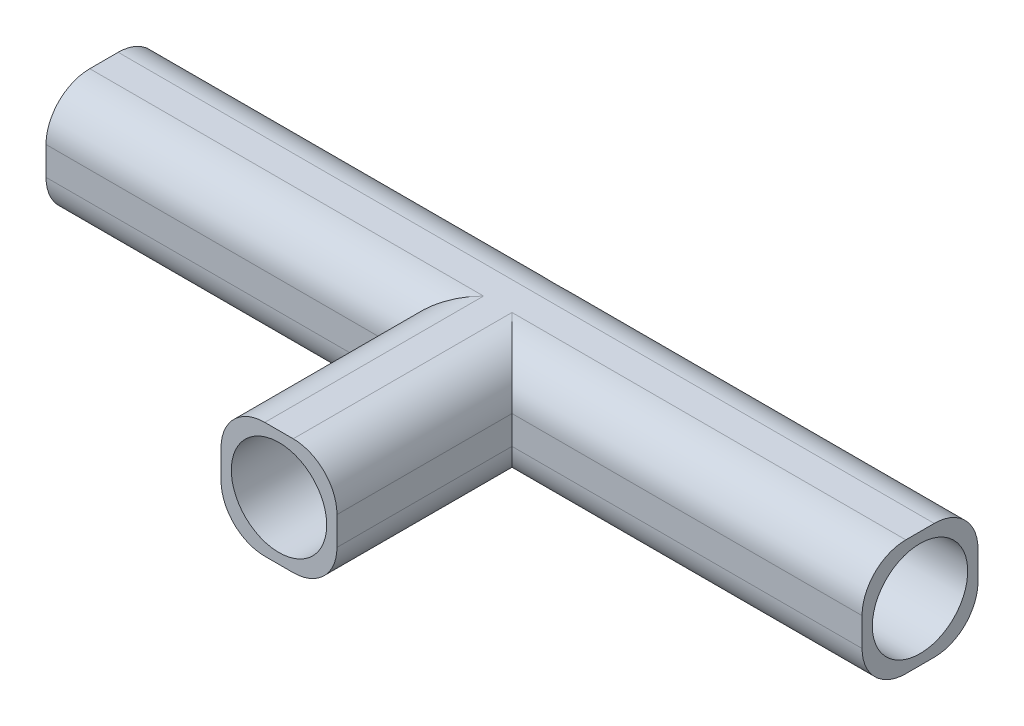
ISO-10303-21;
HEADER;
FILE_DESCRIPTION(('STEP AP214'),'2;1');
FILE_NAME('part.step','',(''),(''),'','','');
FILE_SCHEMA(('AUTOMOTIVE_DESIGN { 1 0 10303 214 1 1 1 1 }'));
ENDSEC;
DATA;
#1=APPLICATION_CONTEXT('core data for automotive mechanical design processes');
#2=APPLICATION_PROTOCOL_DEFINITION('international standard','automotive_design',2000,#1);
#3=PRODUCT_CONTEXT('',#1,'mechanical');
#4=PRODUCT('Part','Part','',(#3));
#5=PRODUCT_RELATED_PRODUCT_CATEGORY('part','',(#4));
#6=PRODUCT_DEFINITION_FORMATION('','',#4);
#7=PRODUCT_DEFINITION_CONTEXT('part definition',#1,'design');
#8=PRODUCT_DEFINITION('design','',#6,#7);
#9=PRODUCT_DEFINITION_SHAPE('','',#8);
#10=(LENGTH_UNIT() NAMED_UNIT(*) SI_UNIT(.MILLI.,.METRE.));
#11=(NAMED_UNIT(*) PLANE_ANGLE_UNIT() SI_UNIT($,.RADIAN.));
#12=(NAMED_UNIT(*) SI_UNIT($,.STERADIAN.) SOLID_ANGLE_UNIT());
#13=UNCERTAINTY_MEASURE_WITH_UNIT(LENGTH_MEASURE(1.E-05),#10,'distance_accuracy_value','');
#14=(GEOMETRIC_REPRESENTATION_CONTEXT(3) GLOBAL_UNCERTAINTY_ASSIGNED_CONTEXT((#13)) GLOBAL_UNIT_ASSIGNED_CONTEXT((#10,
#11,#12)) REPRESENTATION_CONTEXT('',''));
#15=CARTESIAN_POINT('',(0.,0.,0.));
#16=DIRECTION('',(0.,0.,1.));
#17=DIRECTION('',(1.,0.,0.));
#18=AXIS2_PLACEMENT_3D('',#15,#16,#17);
#19=CARTESIAN_POINT('',(0.,26.5,-66.5));
#20=DIRECTION('',(0.,0.,1.));
#21=DIRECTION('',(1.,0.,0.));
#22=AXIS2_PLACEMENT_3D('',#19,#20,#21);
#23=PLANE('',#22);
#24=DIRECTION('',(0.,-1.,0.));
#25=VECTOR('',#24,1.);
#26=CARTESIAN_POINT('',(-80.,26.5,-66.5));
#27=LINE('',#26,#25);
#28=CARTESIAN_POINT('',(-80.,16.5,-66.5));
#29=VERTEX_POINT('',#28);
#30=CARTESIAN_POINT('',(-80.,10.,-66.5));
#31=VERTEX_POINT('',#30);
#32=EDGE_CURVE('E191',#29,#31,#27,.T.);
#33=ORIENTED_EDGE('',*,*,#32,.F.);
#34=DIRECTION('',(-1.,0.,0.));
#35=VECTOR('',#34,1.);
#36=CARTESIAN_POINT('',(0.,16.5,-66.5));
#37=LINE('',#36,#35);
#38=CARTESIAN_POINT('',(2.8457941196841,16.5,-66.5));
#39=VERTEX_POINT('',#38);
#40=EDGE_CURVE('E312',#29,#39,#37,.F.);
#41=ORIENTED_EDGE('',*,*,#40,.T.);
#42=CARTESIAN_POINT('',(13.25,13.25,-66.5));
#43=DIRECTION('',(0.,0.,1.));
#44=DIRECTION('',(1.,0.,0.));
#45=AXIS2_PLACEMENT_3D('',#42,#43,#44);
#46=CIRCLE('',#45,10.9);
#47=CARTESIAN_POINT('',(2.8457941196841,10.,-66.5));
#48=VERTEX_POINT('',#47);
#49=EDGE_CURVE('E215',#39,#48,#46,.T.);
#50=ORIENTED_EDGE('',*,*,#49,.T.);
#51=DIRECTION('',(-1.,0.,0.));
#52=VECTOR('',#51,1.);
#53=CARTESIAN_POINT('',(-80.,10.,-66.5));
#54=LINE('',#53,#52);
#55=EDGE_CURVE('E310',#48,#31,#54,.T.);
#56=ORIENTED_EDGE('',*,*,#55,.T.);
#57=EDGE_LOOP('',(#33,#41,#50,#56));
#58=FACE_BOUND('',#57,.T.);
#59=ADVANCED_FACE('F39',(#58),#23,.F.);
#60=CARTESIAN_POINT('',(13.25,13.25,-66.5));
#61=DIRECTION('',(0.,0.,1.));
#62=DIRECTION('',(1.,0.,0.));
#63=AXIS2_PLACEMENT_3D('',#60,#61,#62);
#64=CYLINDRICAL_SURFACE('',#63,10.9);
#65=CARTESIAN_POINT('',(13.25,13.25,0.));
#66=DIRECTION('',(0.,0.,1.));
#67=DIRECTION('',(1.,0.,0.));
#68=AXIS2_PLACEMENT_3D('',#65,#66,#67);
#69=CIRCLE('',#68,10.9);
#70=CARTESIAN_POINT('',(24.15,13.25,0.));
#71=VERTEX_POINT('',#70);
#72=EDGE_CURVE('E207',#71,#71,#69,.T.);
#73=ORIENTED_EDGE('',*,*,#72,.T.);
#74=EDGE_LOOP('',(#73));
#75=FACE_BOUND('',#74,.T.);
#76=CARTESIAN_POINT('',(13.25,13.25,-53.25));
#77=DIRECTION('',(0.707106781186547,0.,0.707106781186547));
#78=DIRECTION('',(-0.707106781186547,0.,0.707106781186547));
#79=AXIS2_PLACEMENT_3D('',#76,#77,#78);
#80=ELLIPSE('',#79,15.4149278298667,10.9);
#81=CARTESIAN_POINT('',(13.25,2.35,-53.25));
#82=VERTEX_POINT('',#81);
#83=CARTESIAN_POINT('',(13.25,24.15,-53.25));
#84=VERTEX_POINT('',#83);
#85=EDGE_CURVE('E179',#82,#84,#80,.F.);
#86=ORIENTED_EDGE('',*,*,#85,.T.);
#87=CARTESIAN_POINT('',(13.25,13.25,-53.25));
#88=DIRECTION('',(-0.707106781186547,0.,0.707106781186547));
#89=DIRECTION('',(0.707106781186547,0.,0.707106781186547));
#90=AXIS2_PLACEMENT_3D('',#87,#88,#89);
#91=ELLIPSE('',#90,15.4149278298667,10.9);
#92=EDGE_CURVE('E176',#84,#82,#91,.F.);
#93=ORIENTED_EDGE('',*,*,#92,.T.);
#94=EDGE_LOOP('',(#86,#93));
#95=FACE_BOUND('',#94,.T.);
#96=ADVANCED_FACE('F189',(#75,#95),#64,.F.);
#97=CARTESIAN_POINT('',(0.,26.5,0.));
#98=DIRECTION('',(1.,0.,0.));
#99=DIRECTION('',(0.,0.,-1.));
#100=AXIS2_PLACEMENT_3D('',#97,#98,#99);
#101=PLANE('',#100);
#102=DIRECTION('',(0.,-1.,0.));
#103=VECTOR('',#102,1.);
#104=CARTESIAN_POINT('',(0.,26.5,0.));
#105=LINE('',#104,#103);
#106=CARTESIAN_POINT('',(0.,16.5,0.));
#107=VERTEX_POINT('',#106);
#108=CARTESIAN_POINT('',(0.,10.,0.));
#109=VERTEX_POINT('',#108);
#110=EDGE_CURVE('E225',#107,#109,#105,.T.);
#111=ORIENTED_EDGE('',*,*,#110,.F.);
#112=DIRECTION('',(0.,0.,1.));
#113=VECTOR('',#112,1.);
#114=CARTESIAN_POINT('',(0.,16.5,0.));
#115=LINE('',#114,#113);
#116=CARTESIAN_POINT('',(0.,16.5,-40.));
#117=VERTEX_POINT('',#116);
#118=EDGE_CURVE('E267',#107,#117,#115,.F.);
#119=ORIENTED_EDGE('',*,*,#118,.T.);
#120=DIRECTION('',(0.,1.,0.));
#121=VECTOR('',#120,1.);
#122=CARTESIAN_POINT('',(0.,26.5,-40.));
#123=LINE('',#122,#121);
#124=CARTESIAN_POINT('',(0.,10.,-40.));
#125=VERTEX_POINT('',#124);
#126=EDGE_CURVE('E186',#125,#117,#123,.T.);
#127=ORIENTED_EDGE('',*,*,#126,.F.);
#128=DIRECTION('',(0.,0.,1.));
#129=VECTOR('',#128,1.);
#130=CARTESIAN_POINT('',(0.,10.,0.));
#131=LINE('',#130,#129);
#132=EDGE_CURVE('E265',#125,#109,#131,.T.);
#133=ORIENTED_EDGE('',*,*,#132,.T.);
#134=EDGE_LOOP('',(#111,#119,#127,#133));
#135=FACE_BOUND('',#134,.T.);
#136=ADVANCED_FACE('F342',(#135),#101,.F.);
#137=CARTESIAN_POINT('',(26.5,26.5,0.));
#138=DIRECTION('',(0.,0.,-1.));
#139=DIRECTION('',(-1.,0.,0.));
#140=AXIS2_PLACEMENT_3D('',#137,#138,#139);
#141=PLANE('',#140);
#142=ORIENTED_EDGE('',*,*,#72,.F.);
#143=EDGE_LOOP('',(#142));
#144=FACE_BOUND('',#143,.T.);
#145=DIRECTION('',(1.,0.,0.));
#146=VECTOR('',#145,1.);
#147=CARTESIAN_POINT('',(26.5,26.5,0.));
#148=LINE('',#147,#146);
#149=CARTESIAN_POINT('',(10.,26.5,0.));
#150=VERTEX_POINT('',#149);
#151=CARTESIAN_POINT('',(16.5,26.5,0.));
#152=VERTEX_POINT('',#151);
#153=EDGE_CURVE('E213',#150,#152,#148,.T.);
#154=ORIENTED_EDGE('',*,*,#153,.F.);
#155=CARTESIAN_POINT('',(10.,16.5,0.));
#156=DIRECTION('',(0.,0.,-1.));
#157=DIRECTION('',(-1.,0.,0.));
#158=AXIS2_PLACEMENT_3D('',#155,#156,#157);
#159=CIRCLE('',#158,10.);
#160=EDGE_CURVE('E262',#150,#107,#159,.F.);
#161=ORIENTED_EDGE('',*,*,#160,.T.);
#162=ORIENTED_EDGE('',*,*,#110,.T.);
#163=CARTESIAN_POINT('',(10.,10.,0.));
#164=DIRECTION('',(0.,0.,-1.));
#165=DIRECTION('',(-1.,0.,0.));
#166=AXIS2_PLACEMENT_3D('',#163,#164,#165);
#167=CIRCLE('',#166,10.);
#168=CARTESIAN_POINT('',(10.,0.,0.));
#169=VERTEX_POINT('',#168);
#170=EDGE_CURVE('E260',#109,#169,#167,.F.);
#171=ORIENTED_EDGE('',*,*,#170,.T.);
#172=DIRECTION('',(1.,0.,0.));
#173=VECTOR('',#172,1.);
#174=CARTESIAN_POINT('',(26.5,0.,0.));
#175=LINE('',#174,#173);
#176=CARTESIAN_POINT('',(16.5,0.,0.));
#177=VERTEX_POINT('',#176);
#178=EDGE_CURVE('E223',#169,#177,#175,.T.);
#179=ORIENTED_EDGE('',*,*,#178,.T.);
#180=CARTESIAN_POINT('',(16.5,10.,0.));
#181=DIRECTION('',(0.,0.,-1.));
#182=DIRECTION('',(-1.,0.,0.));
#183=AXIS2_PLACEMENT_3D('',#180,#181,#182);
#184=CIRCLE('',#183,10.);
#185=CARTESIAN_POINT('',(26.5,10.,0.));
#186=VERTEX_POINT('',#185);
#187=EDGE_CURVE('E253',#177,#186,#184,.F.);
#188=ORIENTED_EDGE('',*,*,#187,.T.);
#189=DIRECTION('',(0.,-1.,0.));
#190=VECTOR('',#189,1.);
#191=CARTESIAN_POINT('',(26.5,26.5,0.));
#192=LINE('',#191,#190);
#193=CARTESIAN_POINT('',(26.5,16.5,0.));
#194=VERTEX_POINT('',#193);
#195=EDGE_CURVE('E237',#194,#186,#192,.T.);
#196=ORIENTED_EDGE('',*,*,#195,.F.);
#197=CARTESIAN_POINT('',(16.5,16.5,0.));
#198=DIRECTION('',(0.,0.,-1.));
#199=DIRECTION('',(-1.,0.,0.));
#200=AXIS2_PLACEMENT_3D('',#197,#198,#199);
#201=CIRCLE('',#200,10.);
#202=EDGE_CURVE('E256',#194,#152,#201,.F.);
#203=ORIENTED_EDGE('',*,*,#202,.T.);
#204=EDGE_LOOP('',(#154,#161,#162,#171,#179,#188,#196,#203));
#205=FACE_BOUND('',#204,.T.);
#206=ADVANCED_FACE('F341',(#144,#205),#141,.F.);
#207=CARTESIAN_POINT('',(26.5,26.5,-40.));
#208=DIRECTION('',(-1.,0.,0.));
#209=DIRECTION('',(0.,0.,1.));
#210=AXIS2_PLACEMENT_3D('',#207,#208,#209);
#211=PLANE('',#210);
#212=DIRECTION('',(0.,-1.,0.));
#213=VECTOR('',#212,1.);
#214=CARTESIAN_POINT('',(26.5,26.5,-40.));
#215=LINE('',#214,#213);
#216=CARTESIAN_POINT('',(26.5,16.5,-40.));
#217=VERTEX_POINT('',#216);
#218=CARTESIAN_POINT('',(26.5,10.,-40.));
#219=VERTEX_POINT('',#218);
#220=EDGE_CURVE('E236',#217,#219,#215,.T.);
#221=ORIENTED_EDGE('',*,*,#220,.F.);
#222=DIRECTION('',(0.,0.,-1.));
#223=VECTOR('',#222,1.);
#224=CARTESIAN_POINT('',(26.5,16.5,-40.));
#225=LINE('',#224,#223);
#226=EDGE_CURVE('E272',#217,#194,#225,.F.);
#227=ORIENTED_EDGE('',*,*,#226,.T.);
#228=ORIENTED_EDGE('',*,*,#195,.T.);
#229=DIRECTION('',(0.,0.,-1.));
#230=VECTOR('',#229,1.);
#231=CARTESIAN_POINT('',(26.5,10.,-40.));
#232=LINE('',#231,#230);
#233=EDGE_CURVE('E268',#186,#219,#232,.T.);
#234=ORIENTED_EDGE('',*,*,#233,.T.);
#235=EDGE_LOOP('',(#221,#227,#228,#234));
#236=FACE_BOUND('',#235,.T.);
#237=ADVANCED_FACE('F358',(#236),#211,.F.);
#238=CARTESIAN_POINT('',(106.5,26.5,-40.));
#239=DIRECTION('',(0.,0.,-1.));
#240=DIRECTION('',(-1.,0.,0.));
#241=AXIS2_PLACEMENT_3D('',#238,#239,#240);
#242=PLANE('',#241);
#243=ORIENTED_EDGE('',*,*,#220,.T.);
#244=DIRECTION('',(1.,0.,0.));
#245=VECTOR('',#244,1.);
#246=CARTESIAN_POINT('',(106.5,10.,-40.));
#247=LINE('',#246,#245);
#248=CARTESIAN_POINT('',(106.5,10.,-40.));
#249=VERTEX_POINT('',#248);
#250=EDGE_CURVE('E283',#219,#249,#247,.T.);
#251=ORIENTED_EDGE('',*,*,#250,.T.);
#252=DIRECTION('',(0.,-1.,0.));
#253=VECTOR('',#252,1.);
#254=CARTESIAN_POINT('',(106.5,26.5,-40.));
#255=LINE('',#254,#253);
#256=CARTESIAN_POINT('',(106.5,16.5,-40.));
#257=VERTEX_POINT('',#256);
#258=EDGE_CURVE('E231',#257,#249,#255,.T.);
#259=ORIENTED_EDGE('',*,*,#258,.F.);
#260=DIRECTION('',(1.,0.,0.));
#261=VECTOR('',#260,1.);
#262=CARTESIAN_POINT('',(106.5,16.5,-40.));
#263=LINE('',#262,#261);
#264=EDGE_CURVE('E285',#257,#217,#263,.F.);
#265=ORIENTED_EDGE('',*,*,#264,.T.);
#266=EDGE_LOOP('',(#243,#251,#259,#265));
#267=FACE_BOUND('',#266,.T.);
#268=ADVANCED_FACE('F355',(#267),#242,.F.);
#269=CARTESIAN_POINT('',(106.5,26.5,-66.5));
#270=DIRECTION('',(-1.,0.,0.));
#271=DIRECTION('',(0.,0.,1.));
#272=AXIS2_PLACEMENT_3D('',#269,#270,#271);
#273=PLANE('',#272);
#274=CARTESIAN_POINT('',(106.5,13.25,-53.25));
#275=DIRECTION('',(-1.,0.,0.));
#276=DIRECTION('',(0.,0.,1.));
#277=AXIS2_PLACEMENT_3D('',#274,#275,#276);
#278=CIRCLE('',#277,10.9);
#279=CARTESIAN_POINT('',(106.5,13.25,-42.35));
#280=VERTEX_POINT('',#279);
#281=EDGE_CURVE('E187',#280,#280,#278,.T.);
#282=ORIENTED_EDGE('',*,*,#281,.T.);
#283=EDGE_LOOP('',(#282));
#284=FACE_BOUND('',#283,.T.);
#285=ORIENTED_EDGE('',*,*,#258,.T.);
#286=CARTESIAN_POINT('',(106.5,10.,-50.));
#287=DIRECTION('',(-1.,0.,0.));
#288=DIRECTION('',(0.,0.,1.));
#289=AXIS2_PLACEMENT_3D('',#286,#287,#288);
#290=CIRCLE('',#289,10.);
#291=CARTESIAN_POINT('',(106.5,0.,-50.));
#292=VERTEX_POINT('',#291);
#293=EDGE_CURVE('E291',#249,#292,#290,.F.);
#294=ORIENTED_EDGE('',*,*,#293,.T.);
#295=DIRECTION('',(0.,0.,-1.));
#296=VECTOR('',#295,1.);
#297=CARTESIAN_POINT('',(106.5,0.,-66.5));
#298=LINE('',#297,#296);
#299=CARTESIAN_POINT('',(106.5,0.,-56.5));
#300=VERTEX_POINT('',#299);
#301=EDGE_CURVE('E216',#292,#300,#298,.T.);
#302=ORIENTED_EDGE('',*,*,#301,.T.);
#303=CARTESIAN_POINT('',(106.5,10.,-56.5));
#304=DIRECTION('',(-1.,0.,0.));
#305=DIRECTION('',(0.,0.,1.));
#306=AXIS2_PLACEMENT_3D('',#303,#304,#305);
#307=CIRCLE('',#306,10.);
#308=CARTESIAN_POINT('',(106.5,10.,-66.5));
#309=VERTEX_POINT('',#308);
#310=EDGE_CURVE('E290',#300,#309,#307,.F.);
#311=ORIENTED_EDGE('',*,*,#310,.T.);
#312=DIRECTION('',(0.,-1.,0.));
#313=VECTOR('',#312,1.);
#314=CARTESIAN_POINT('',(106.5,26.5,-66.5));
#315=LINE('',#314,#313);
#316=CARTESIAN_POINT('',(106.5,16.5,-66.5));
#317=VERTEX_POINT('',#316);
#318=EDGE_CURVE('E229',#317,#309,#315,.T.);
#319=ORIENTED_EDGE('',*,*,#318,.F.);
#320=CARTESIAN_POINT('',(106.5,16.5,-56.5));
#321=DIRECTION('',(-1.,0.,0.));
#322=DIRECTION('',(0.,0.,1.));
#323=AXIS2_PLACEMENT_3D('',#320,#321,#322);
#324=CIRCLE('',#323,10.);
#325=CARTESIAN_POINT('',(106.5,26.5,-56.5));
#326=VERTEX_POINT('',#325);
#327=EDGE_CURVE('E289',#317,#326,#324,.F.);
#328=ORIENTED_EDGE('',*,*,#327,.T.);
#329=DIRECTION('',(0.,0.,-1.));
#330=VECTOR('',#329,1.);
#331=CARTESIAN_POINT('',(106.5,26.5,-66.5));
#332=LINE('',#331,#330);
#333=CARTESIAN_POINT('',(106.5,26.5,-50.));
#334=VERTEX_POINT('',#333);
#335=EDGE_CURVE('E220',#334,#326,#332,.T.);
#336=ORIENTED_EDGE('',*,*,#335,.F.);
#337=CARTESIAN_POINT('',(106.5,16.5,-50.));
#338=DIRECTION('',(-1.,0.,0.));
#339=DIRECTION('',(0.,0.,1.));
#340=AXIS2_PLACEMENT_3D('',#337,#338,#339);
#341=CIRCLE('',#340,10.);
#342=EDGE_CURVE('E293',#334,#257,#341,.F.);
#343=ORIENTED_EDGE('',*,*,#342,.T.);
#344=EDGE_LOOP('',(#285,#294,#302,#311,#319,#328,#336,#343));
#345=FACE_BOUND('',#344,.T.);
#346=ADVANCED_FACE('F350',(#284,#345),#273,.F.);
#347=CARTESIAN_POINT('',(23.6542058803159,10.,-66.5));
#348=VERTEX_POINT('',#347);
#349=CARTESIAN_POINT('',(23.6542058803159,16.5,-66.5));
#350=VERTEX_POINT('',#349);
#351=EDGE_CURVE('E209',#348,#350,#46,.T.);
#352=ORIENTED_EDGE('',*,*,#351,.T.);
#353=DIRECTION('',(-1.,0.,0.));
#354=VECTOR('',#353,1.);
#355=CARTESIAN_POINT('',(0.,16.5,-66.5));
#356=LINE('',#355,#354);
#357=EDGE_CURVE('E311',#350,#317,#356,.F.);
#358=ORIENTED_EDGE('',*,*,#357,.T.);
#359=ORIENTED_EDGE('',*,*,#318,.T.);
#360=DIRECTION('',(-1.,0.,0.));
#361=VECTOR('',#360,1.);
#362=CARTESIAN_POINT('',(-80.,10.,-66.5));
#363=LINE('',#362,#361);
#364=EDGE_CURVE('E307',#309,#348,#363,.T.);
#365=ORIENTED_EDGE('',*,*,#364,.T.);
#366=EDGE_LOOP('',(#352,#358,#359,#365));
#367=FACE_BOUND('',#366,.T.);
#368=ADVANCED_FACE('F337',(#367),#23,.F.);
#369=CARTESIAN_POINT('',(0.,26.5,0.));
#370=DIRECTION('',(0.,-1.,0.));
#371=DIRECTION('',(0.,0.,-1.));
#372=AXIS2_PLACEMENT_3D('',#369,#370,#371);
#373=PLANE('',#372);
#374=ORIENTED_EDGE('',*,*,#153,.T.);
#375=DIRECTION('',(0.,0.,-1.));
#376=VECTOR('',#375,1.);
#377=CARTESIAN_POINT('',(16.5,26.5,0.));
#378=LINE('',#377,#376);
#379=CARTESIAN_POINT('',(16.5,26.5,-50.));
#380=VERTEX_POINT('',#379);
#381=EDGE_CURVE('E255',#152,#380,#378,.T.);
#382=ORIENTED_EDGE('',*,*,#381,.T.);
#383=DIRECTION('',(1.,0.,0.));
#384=VECTOR('',#383,1.);
#385=CARTESIAN_POINT('',(0.,26.5,-50.));
#386=LINE('',#385,#384);
#387=EDGE_CURVE('E249',#380,#334,#386,.T.);
#388=ORIENTED_EDGE('',*,*,#387,.T.);
#389=ORIENTED_EDGE('',*,*,#335,.T.);
#390=DIRECTION('',(-1.,0.,0.));
#391=VECTOR('',#390,1.);
#392=CARTESIAN_POINT('',(0.,26.5,-56.5));
#393=LINE('',#392,#391);
#394=CARTESIAN_POINT('',(-80.,26.5,-56.5));
#395=VERTEX_POINT('',#394);
#396=EDGE_CURVE('E245',#326,#395,#393,.T.);
#397=ORIENTED_EDGE('',*,*,#396,.T.);
#398=DIRECTION('',(0.,0.,-1.));
#399=VECTOR('',#398,1.);
#400=CARTESIAN_POINT('',(-80.,26.5,-66.5));
#401=LINE('',#400,#399);
#402=CARTESIAN_POINT('',(-80.,26.5,-50.));
#403=VERTEX_POINT('',#402);
#404=EDGE_CURVE('E203',#403,#395,#401,.T.);
#405=ORIENTED_EDGE('',*,*,#404,.F.);
#406=DIRECTION('',(1.,0.,0.));
#407=VECTOR('',#406,1.);
#408=CARTESIAN_POINT('',(0.,26.5,-50.));
#409=LINE('',#408,#407);
#410=CARTESIAN_POINT('',(10.,26.5,-50.));
#411=VERTEX_POINT('',#410);
#412=EDGE_CURVE('E244',#403,#411,#409,.T.);
#413=ORIENTED_EDGE('',*,*,#412,.T.);
#414=DIRECTION('',(0.,0.,1.));
#415=VECTOR('',#414,1.);
#416=CARTESIAN_POINT('',(10.,26.5,0.));
#417=LINE('',#416,#415);
#418=EDGE_CURVE('E250',#411,#150,#417,.T.);
#419=ORIENTED_EDGE('',*,*,#418,.T.);
#420=EDGE_LOOP('',(#374,#382,#388,#389,#397,#405,#413,#419));
#421=FACE_BOUND('',#420,.T.);
#422=ADVANCED_FACE('F335',(#421),#373,.F.);
#423=CARTESIAN_POINT('',(0.,0.,0.));
#424=DIRECTION('',(0.,-1.,0.));
#425=DIRECTION('',(0.,0.,-1.));
#426=AXIS2_PLACEMENT_3D('',#423,#424,#425);
#427=PLANE('',#426);
#428=DIRECTION('',(1.,0.,0.));
#429=VECTOR('',#428,1.);
#430=CARTESIAN_POINT('',(26.5,0.,-50.));
#431=LINE('',#430,#429);
#432=CARTESIAN_POINT('',(16.5,0.,-50.));
#433=VERTEX_POINT('',#432);
#434=EDGE_CURVE('E276',#292,#433,#431,.F.);
#435=ORIENTED_EDGE('',*,*,#434,.T.);
#436=DIRECTION('',(0.,0.,-1.));
#437=VECTOR('',#436,1.);
#438=CARTESIAN_POINT('',(16.5,0.,0.));
#439=LINE('',#438,#437);
#440=EDGE_CURVE('E282',#433,#177,#439,.F.);
#441=ORIENTED_EDGE('',*,*,#440,.T.);
#442=ORIENTED_EDGE('',*,*,#178,.F.);
#443=DIRECTION('',(0.,0.,1.));
#444=VECTOR('',#443,1.);
#445=CARTESIAN_POINT('',(10.,0.,-40.));
#446=LINE('',#445,#444);
#447=CARTESIAN_POINT('',(10.,0.,-50.));
#448=VERTEX_POINT('',#447);
#449=EDGE_CURVE('E273',#169,#448,#446,.F.);
#450=ORIENTED_EDGE('',*,*,#449,.T.);
#451=DIRECTION('',(1.,0.,0.));
#452=VECTOR('',#451,1.);
#453=CARTESIAN_POINT('',(-80.,0.,-50.));
#454=LINE('',#453,#452);
#455=CARTESIAN_POINT('',(-80.,0.,-50.));
#456=VERTEX_POINT('',#455);
#457=EDGE_CURVE('E271',#448,#456,#454,.F.);
#458=ORIENTED_EDGE('',*,*,#457,.T.);
#459=DIRECTION('',(0.,0.,1.));
#460=VECTOR('',#459,1.);
#461=CARTESIAN_POINT('',(-80.,0.,-66.5));
#462=LINE('',#461,#460);
#463=CARTESIAN_POINT('',(-80.,0.,-56.5));
#464=VERTEX_POINT('',#463);
#465=EDGE_CURVE('E199',#464,#456,#462,.T.);
#466=ORIENTED_EDGE('',*,*,#465,.F.);
#467=DIRECTION('',(-1.,0.,0.));
#468=VECTOR('',#467,1.);
#469=CARTESIAN_POINT('',(106.5,0.,-56.5));
#470=LINE('',#469,#468);
#471=EDGE_CURVE('E280',#464,#300,#470,.F.);
#472=ORIENTED_EDGE('',*,*,#471,.T.);
#473=ORIENTED_EDGE('',*,*,#301,.F.);
#474=EDGE_LOOP('',(#435,#441,#442,#450,#458,#466,#472,#473));
#475=FACE_BOUND('',#474,.T.);
#476=ADVANCED_FACE('F328',(#475),#427,.T.);
#477=CARTESIAN_POINT('',(13.25,13.25,-53.25));
#478=DIRECTION('',(0.707106781186547,0.,0.707106781186547));
#479=DIRECTION('',(-0.707106781186547,0.,0.707106781186547));
#480=AXIS2_PLACEMENT_3D('',#477,#478,#479);
#481=ELLIPSE('',#480,15.4149278298667,10.9);
#482=EDGE_CURVE('E175',#82,#84,#481,.T.);
#483=ORIENTED_EDGE('',*,*,#482,.T.);
#484=CARTESIAN_POINT('',(13.25,13.25,-53.25));
#485=DIRECTION('',(-0.707106781186547,0.,0.707106781186547));
#486=DIRECTION('',(0.707106781186547,0.,0.707106781186547));
#487=AXIS2_PLACEMENT_3D('',#484,#485,#486);
#488=ELLIPSE('',#487,15.4149278298667,10.9);
#489=EDGE_CURVE('E177',#84,#82,#488,.T.);
#490=ORIENTED_EDGE('',*,*,#489,.T.);
#491=EDGE_LOOP('',(#483,#490));
#492=FACE_BOUND('',#491,.T.);
#493=ORIENTED_EDGE('',*,*,#49,.F.);
#494=CARTESIAN_POINT('',(2.8457941196841,16.5,-66.5));
#495=CARTESIAN_POINT('',(2.88464672592702,16.6243861980135,-66.5000018375319));
#496=CARTESIAN_POINT('',(2.92572709811874,16.7480493403431,-66.4976787328515));
#497=CARTESIAN_POINT('',(3.01222916332854,16.993660215835,-66.4885632084519));
#498=CARTESIAN_POINT('',(3.05765017352658,17.1156082153532,-66.4817714906982));
#499=CARTESIAN_POINT('',(3.200118274816,17.4781421129981,-66.4549919974717));
#500=CARTESIAN_POINT('',(3.30349699397758,17.7158223848886,-66.4285986984506));
#501=CARTESIAN_POINT('',(3.52484795963407,18.1791758892328,-66.3607668546852));
#502=CARTESIAN_POINT('',(3.64267398274478,18.4049409452479,-66.3194719824814));
#503=CARTESIAN_POINT('',(3.89248232874132,18.8456266620614,-66.2236259048918));
#504=CARTESIAN_POINT('',(4.02446922456363,19.0605437866186,-66.1690704100441));
#505=CARTESIAN_POINT('',(4.30058286463675,19.4773659285029,-66.0489304604639));
#506=CARTESIAN_POINT('',(4.44463848843064,19.679336291958,-65.9834086221667));
#507=CARTESIAN_POINT('',(4.744355018924,20.070911034265,-65.8430132638185));
#508=CARTESIAN_POINT('',(4.90001501929407,20.2605163766906,-65.7681404737913));
#509=CARTESIAN_POINT('',(5.38388466942829,20.8113085016247,-65.531738563742));
#510=CARTESIAN_POINT('',(5.72838774348211,21.1535800974453,-65.3586970408249));
#511=CARTESIAN_POINT('',(6.30393931994564,21.6548787505474,-65.0716382764976));
#512=CARTESIAN_POINT('',(6.52300907320189,21.8311618655614,-64.9627957876634));
#513=CARTESIAN_POINT('',(6.97332608430999,22.1658293228224,-64.7424783730553));
#514=CARTESIAN_POINT('',(7.20457533714213,22.3242107193495,-64.6310030176823));
#515=CARTESIAN_POINT('',(7.67879167476865,22.6228442770978,-64.408569199843));
#516=CARTESIAN_POINT('',(7.921761472171,22.7630922135932,-64.2976108636152));
#517=CARTESIAN_POINT('',(8.41919724733462,23.0250875935412,-64.0797249670166));
#518=CARTESIAN_POINT('',(8.67366100904052,23.1468385836509,-63.9727966368852));
#519=CARTESIAN_POINT('',(9.14587471418709,23.3504685629058,-63.7860476625262));
#520=CARTESIAN_POINT('',(9.36170635649495,23.4355568242152,-63.7048720080955));
#521=CARTESIAN_POINT('',(9.80090306979361,23.5925385470033,-63.5503915904373));
#522=CARTESIAN_POINT('',(10.0242680493896,23.664432168492,-63.4770867317659));
#523=CARTESIAN_POINT('',(10.4777250282644,23.7941916712698,-63.3413139231623));
#524=CARTESIAN_POINT('',(10.7078012559922,23.8520878717172,-63.2788226355229));
#525=CARTESIAN_POINT('',(11.1744064602184,23.9532165017965,-63.1674765729432));
#526=CARTESIAN_POINT('',(11.4109338072887,23.9964525978999,-63.118618388925));
#527=CARTESIAN_POINT('',(11.8486622052475,24.0614102205505,-63.044240387643));
#528=CARTESIAN_POINT('',(12.0490732546009,24.0855335673666,-63.0161711089286));
#529=CARTESIAN_POINT('',(12.4522916342809,24.1226551571158,-62.9727085862606));
#530=CARTESIAN_POINT('',(12.6550986575942,24.1356548100637,-62.9573137357338));
#531=CARTESIAN_POINT('',(13.0615647563208,24.1502668784086,-62.9399959887514));
#532=CARTESIAN_POINT('',(13.2652231496363,24.1518871209526,-62.9380638322026));
#533=CARTESIAN_POINT('',(13.6719896367206,24.1437281486369,-62.9477482717478));
#534=CARTESIAN_POINT('',(13.8750977079185,24.1339484731085,-62.9593654153669));
#535=CARTESIAN_POINT('',(14.2785068502842,24.10324528777,-62.9954763959438));
#536=CARTESIAN_POINT('',(14.4788157390124,24.082365018374,-63.0199202638945));
#537=CARTESIAN_POINT('',(14.8762667727059,24.0298654055655,-63.0804801743603));
#538=CARTESIAN_POINT('',(15.0734075057524,23.9982414058973,-63.1166012773763));
#539=CARTESIAN_POINT('',(15.6591744890684,23.8878444858726,-63.2403272164784));
#540=CARTESIAN_POINT('',(16.0417717477987,23.7935763709773,-63.3432563684598));
#541=CARTESIAN_POINT('',(16.7084080999205,23.591387989085,-63.551850448044));
#542=CARTESIAN_POINT('',(16.9963103371359,23.4904588422306,-63.6524302156835));
#543=CARTESIAN_POINT('',(17.5593750794149,23.26653827981,-63.8646297563021));
#544=CARTESIAN_POINT('',(17.8345306170234,23.1435349732412,-63.9762554649452));
#545=CARTESIAN_POINT('',(18.3725077275348,22.8760297628935,-64.2056724221931));
#546=CARTESIAN_POINT('',(18.6352931414189,22.7314694280386,-64.3234798458809));
#547=CARTESIAN_POINT('',(19.1475628503551,22.4216043315495,-64.560562404601));
#548=CARTESIAN_POINT('',(19.397049286503,22.2563029236261,-64.6798372995459));
#549=CARTESIAN_POINT('',(19.8907535658075,21.899070358283,-64.9200934612386));
#550=CARTESIAN_POINT('',(20.1344893692392,21.7064149823394,-65.0409906659449));
#551=CARTESIAN_POINT('',(20.6064364452311,21.2992213865969,-65.2762620277438));
#552=CARTESIAN_POINT('',(20.8346461759613,21.0846809987601,-65.3906355368134));
#553=CARTESIAN_POINT('',(21.2729703473606,20.6351189096964,-65.6083947476499));
#554=CARTESIAN_POINT('',(21.4831727359769,20.4002095460314,-65.7118345078329));
#555=CARTESIAN_POINT('',(21.884912764795,19.9094860178896,-65.9045118249119));
#556=CARTESIAN_POINT('',(22.0764544423562,19.6536763974311,-65.9937524565339));
#557=CARTESIAN_POINT('',(22.4048926039035,19.1716930181385,-66.1391441281059));
#558=CARTESIAN_POINT('',(22.5453272809355,18.9488539676513,-66.198362467987));
#559=CARTESIAN_POINT('',(22.8108706859483,18.4911550937411,-66.3025687808535));
#560=CARTESIAN_POINT('',(22.9359872740858,18.256301523782,-66.3475640710087));
#561=CARTESIAN_POINT('',(23.1709155621477,17.7730934878217,-66.4216739654849));
#562=CARTESIAN_POINT('',(23.2805328872315,17.5246140122395,-66.4505982970072));
#563=CARTESIAN_POINT('',(23.4311714877529,17.1451696299842,-66.4799757738569));
#564=CARTESIAN_POINT('',(23.4791271841872,17.0174371803611,-66.4874338518369));
#565=CARTESIAN_POINT('',(23.5702743819592,16.7600689361994,-66.4974475398995));
#566=CARTESIAN_POINT('',(23.613465002702,16.6304327948541,-66.5000022452554));
#567=CARTESIAN_POINT('',(23.6542058803159,16.5,-66.5));
#568=B_SPLINE_CURVE_WITH_KNOTS('',3,(#494,#495,#496,#497,#498,#499,#500,#501,#502,#503,#504,
#505,#506,#507,#508,#509,#510,#511,#512,#513,#514,#515,#516,#517,#518,#519,#520,#521,#522,#523,
#524,#525,#526,#527,#528,#529,#530,#531,#532,#533,#534,#535,#536,#537,#538,#539,#540,#541,#542,
#543,#544,#545,#546,#547,#548,#549,#550,#551,#552,#553,#554,#555,#556,#557,#558,#559,#560,#561,
#562,#563,#564,#565,#566,#567),.UNSPECIFIED.,.F.,.F.,(4,2,2,2,2,2,2,2,2,2,2,2,2,2,2,2,2,2,2,2,2,
2,2,2,2,2,2,2,2,2,2,2,2,2,2,2,4),(0.,0.390848926054824,0.78163646907384,1.56194565907483,
2.33492420445955,3.10815312156135,3.87710887922689,4.6460046424128,6.1870839483925,
7.09103210749795,7.99512879498972,8.89943574044322,9.80356907207933,10.5404167209573,
11.2772554335757,12.0124835205342,12.7475275921188,13.3582720305828,13.9689390409563,
14.5791859725426,15.189457564964,15.7973691846621,16.4055446057174,17.6230143822188,
18.5855721736446,19.5486500447985,20.5143874882759,21.4799689783793,22.4790054678226,
23.4781410230633,24.4720795971041,25.4658026466376,26.2747388807275,27.0832582707595,
27.9011565944795,28.3109199620505,28.7207589282482),.UNSPECIFIED.);
#569=EDGE_CURVE('E11',#39,#350,#568,.T.);
#570=ORIENTED_EDGE('',*,*,#569,.T.);
#571=ORIENTED_EDGE('',*,*,#351,.F.);
#572=CARTESIAN_POINT('',(23.6542058803159,10.,-66.5));
#573=CARTESIAN_POINT('',(23.615353274073,9.87561380198645,-66.5000018375319));
#574=CARTESIAN_POINT('',(23.5742729018813,9.75195065965694,-66.4976787328515));
#575=CARTESIAN_POINT('',(23.4877708366715,9.50633978416503,-66.4885632084519));
#576=CARTESIAN_POINT('',(23.4423498264734,9.38439178464682,-66.4817714906982));
#577=CARTESIAN_POINT('',(23.299881725184,9.02185788700186,-66.4549919974717));
#578=CARTESIAN_POINT('',(23.1965030060224,8.78417761511139,-66.4285986984506));
#579=CARTESIAN_POINT('',(22.9751520403659,8.3208241107672,-66.3607668546852));
#580=CARTESIAN_POINT('',(22.8573260172552,8.0950590547521,-66.3194719824814));
#581=CARTESIAN_POINT('',(22.6075176712587,7.65437333793856,-66.2236259048918));
#582=CARTESIAN_POINT('',(22.4755307754364,7.43945621338143,-66.1690704100441));
#583=CARTESIAN_POINT('',(22.1994171353633,7.02263407149709,-66.0489304604639));
#584=CARTESIAN_POINT('',(22.0553615115694,6.82066370804202,-65.9834086221667));
#585=CARTESIAN_POINT('',(21.755644981076,6.42908896573497,-65.8430132638185));
#586=CARTESIAN_POINT('',(21.5999849807059,6.23948362330945,-65.7681404737913));
#587=CARTESIAN_POINT('',(21.1161153305717,5.68869149837528,-65.531738563742));
#588=CARTESIAN_POINT('',(20.7716122565179,5.34641990255469,-65.3586970408249));
#589=CARTESIAN_POINT('',(20.1960606800544,4.84512124945263,-65.0716382764976));
#590=CARTESIAN_POINT('',(19.9769909267981,4.66883813443863,-64.9627957876634));
#591=CARTESIAN_POINT('',(19.52667391569,4.33417067717764,-64.7424783730553));
#592=CARTESIAN_POINT('',(19.2954246628579,4.17578928065046,-64.6310030176823));
#593=CARTESIAN_POINT('',(18.8212083252313,3.87715572290216,-64.408569199843));
#594=CARTESIAN_POINT('',(18.578238527829,3.73690778640681,-64.2976108636152));
#595=CARTESIAN_POINT('',(18.0808027526654,3.47491240645877,-64.0797249670166));
#596=CARTESIAN_POINT('',(17.8263389909595,3.35316141634906,-63.9727966368852));
#597=CARTESIAN_POINT('',(17.3541252858129,3.14953143709417,-63.7860476625262));
#598=CARTESIAN_POINT('',(17.1382936435051,3.06444317578484,-63.7048720080955));
#599=CARTESIAN_POINT('',(16.6990969302064,2.90746145299671,-63.5503915904373));
#600=CARTESIAN_POINT('',(16.4757319506104,2.835567831508,-63.4770867317659));
#601=CARTESIAN_POINT('',(16.0222749717356,2.7058083287302,-63.3413139231623));
#602=CARTESIAN_POINT('',(15.7921987440078,2.64791212828283,-63.2788226355229));
#603=CARTESIAN_POINT('',(15.3255935397816,2.54678349820351,-63.1674765729432));
#604=CARTESIAN_POINT('',(15.0890661927113,2.50354740210011,-63.118618388925));
#605=CARTESIAN_POINT('',(14.6513377947525,2.43858977944946,-63.044240387643));
#606=CARTESIAN_POINT('',(14.4509267453991,2.41446643263336,-63.0161711089286));
#607=CARTESIAN_POINT('',(14.047708365719,2.37734484288424,-62.9727085862606));
#608=CARTESIAN_POINT('',(13.8449013424058,2.36434518993631,-62.9573137357338));
#609=CARTESIAN_POINT('',(13.4384352436792,2.34973312159136,-62.9399959887514));
#610=CARTESIAN_POINT('',(13.2347768503637,2.34811287904744,-62.9380638322026));
#611=CARTESIAN_POINT('',(12.8280103632794,2.35627185136307,-62.9477482717478));
#612=CARTESIAN_POINT('',(12.6249022920815,2.36605152689148,-62.9593654153669));
#613=CARTESIAN_POINT('',(12.2214931497158,2.39675471223002,-62.9954763959438));
#614=CARTESIAN_POINT('',(12.0211842609876,2.41763498162603,-63.0199202638945));
#615=CARTESIAN_POINT('',(11.6237332272941,2.47013459443447,-63.0804801743603));
#616=CARTESIAN_POINT('',(11.4265924942476,2.50175859410271,-63.1166012773763));
#617=CARTESIAN_POINT('',(10.8408255109316,2.61215551412741,-63.2403272164784));
#618=CARTESIAN_POINT('',(10.4582282522013,2.7064236290227,-63.3432563684598));
#619=CARTESIAN_POINT('',(9.79159190007948,2.90861201091502,-63.551850448044));
#620=CARTESIAN_POINT('',(9.50368966286409,3.00954115776937,-63.6524302156835));
#621=CARTESIAN_POINT('',(8.94062492058509,3.23346172018999,-63.8646297563021));
#622=CARTESIAN_POINT('',(8.6654693829766,3.35646502675883,-63.9762554649452));
#623=CARTESIAN_POINT('',(8.12749227246521,3.62397023710648,-64.2056724221931));
#624=CARTESIAN_POINT('',(7.86470685858113,3.76853057196142,-64.3234798458809));
#625=CARTESIAN_POINT('',(7.35243714964485,4.07839566845047,-64.560562404601));
#626=CARTESIAN_POINT('',(7.10295071349696,4.24369707637388,-64.6798372995459));
#627=CARTESIAN_POINT('',(6.60924643419247,4.60092964171698,-64.9200934612386));
#628=CARTESIAN_POINT('',(6.36551063076076,4.79358501766057,-65.0409906659449));
#629=CARTESIAN_POINT('',(5.8935635547689,5.20077861340313,-65.2762620277438));
#630=CARTESIAN_POINT('',(5.6653538240387,5.41531900123986,-65.3906355368134));
#631=CARTESIAN_POINT('',(5.22702965263943,5.86488109030358,-65.6083947476499));
#632=CARTESIAN_POINT('',(5.01682726402313,6.09979045396858,-65.7118345078329));
#633=CARTESIAN_POINT('',(4.61508723520496,6.59051398211042,-65.9045118249119));
#634=CARTESIAN_POINT('',(4.42354555764385,6.84632360256887,-65.9937524565339));
#635=CARTESIAN_POINT('',(4.09510739609646,7.32830698186155,-66.1391441281059));
#636=CARTESIAN_POINT('',(3.95467271906451,7.55114603234875,-66.198362467987));
#637=CARTESIAN_POINT('',(3.68912931405172,8.00884490625886,-66.3025687808535));
#638=CARTESIAN_POINT('',(3.56401272591424,8.24369847621799,-66.3475640710087));
#639=CARTESIAN_POINT('',(3.3290844378523,8.72690651217834,-66.4216739654849));
#640=CARTESIAN_POINT('',(3.21946711276854,8.97538598776048,-66.4505982970072));
#641=CARTESIAN_POINT('',(3.06882851224709,9.35483037001581,-66.4799757738569));
#642=CARTESIAN_POINT('',(3.02087281581275,9.48256281963891,-66.4874338518369));
#643=CARTESIAN_POINT('',(2.92972561804084,9.73993106380055,-66.4974475398995));
#644=CARTESIAN_POINT('',(2.88653499729801,9.86956720514589,-66.5000022452554));
#645=CARTESIAN_POINT('',(2.8457941196841,9.99999999999999,-66.5));
#646=B_SPLINE_CURVE_WITH_KNOTS('',3,(#572,#573,#574,#575,#576,#577,#578,#579,#580,#581,#582,
#583,#584,#585,#586,#587,#588,#589,#590,#591,#592,#593,#594,#595,#596,#597,#598,#599,#600,#601,
#602,#603,#604,#605,#606,#607,#608,#609,#610,#611,#612,#613,#614,#615,#616,#617,#618,#619,#620,
#621,#622,#623,#624,#625,#626,#627,#628,#629,#630,#631,#632,#633,#634,#635,#636,#637,#638,#639,
#640,#641,#642,#643,#644,#645),.UNSPECIFIED.,.F.,.F.,(4,2,2,2,2,2,2,2,2,2,2,2,2,2,2,2,2,2,2,2,2,
2,2,2,2,2,2,2,2,2,2,2,2,2,2,2,4),(0.,0.390848926054822,0.78163646907384,1.56194565907483,
2.33492420445955,3.10815312156134,3.87710887922687,4.64600464241279,6.18708394839249,
7.09103210749795,7.99512879498971,8.89943574044321,9.80356907207932,10.5404167209573,
11.2772554335757,12.0124835205342,12.7475275921188,13.3582720305828,13.9689390409563,
14.5791859725426,15.189457564964,15.7973691846621,16.4055446057174,17.6230143822188,
18.5855721736446,19.5486500447985,20.5143874882759,21.4799689783793,22.4790054678226,
23.4781410230633,24.4720795971041,25.4658026466376,26.2747388807274,27.0832582707595,
27.9011565944795,28.3109199620505,28.7207589282482),.UNSPECIFIED.);
#647=EDGE_CURVE('E47',#348,#48,#646,.T.);
#648=ORIENTED_EDGE('',*,*,#647,.T.);
#649=EDGE_LOOP('',(#493,#570,#571,#648));
#650=FACE_BOUND('',#649,.T.);
#651=ADVANCED_FACE('F192',(#492,#650),#64,.F.);
#652=CARTESIAN_POINT('',(-80.,26.5,-40.));
#653=DIRECTION('',(0.,0.,-1.));
#654=DIRECTION('',(-1.,0.,0.));
#655=AXIS2_PLACEMENT_3D('',#652,#653,#654);
#656=PLANE('',#655);
#657=ORIENTED_EDGE('',*,*,#126,.T.);
#658=DIRECTION('',(1.,0.,0.));
#659=VECTOR('',#658,1.);
#660=CARTESIAN_POINT('',(-80.,16.5,-40.));
#661=LINE('',#660,#659);
#662=CARTESIAN_POINT('',(-80.,16.5,-40.));
#663=VERTEX_POINT('',#662);
#664=EDGE_CURVE('E300',#117,#663,#661,.F.);
#665=ORIENTED_EDGE('',*,*,#664,.T.);
#666=DIRECTION('',(0.,1.,0.));
#667=VECTOR('',#666,1.);
#668=CARTESIAN_POINT('',(-80.,26.5,-40.));
#669=LINE('',#668,#667);
#670=CARTESIAN_POINT('',(-80.,10.,-40.));
#671=VERTEX_POINT('',#670);
#672=EDGE_CURVE('E198',#671,#663,#669,.T.);
#673=ORIENTED_EDGE('',*,*,#672,.F.);
#674=DIRECTION('',(1.,0.,0.));
#675=VECTOR('',#674,1.);
#676=CARTESIAN_POINT('',(0.,10.,-40.));
#677=LINE('',#676,#675);
#678=EDGE_CURVE('E294',#671,#125,#677,.T.);
#679=ORIENTED_EDGE('',*,*,#678,.T.);
#680=EDGE_LOOP('',(#657,#665,#673,#679));
#681=FACE_BOUND('',#680,.T.);
#682=ADVANCED_FACE('F326',(#681),#656,.F.);
#683=CARTESIAN_POINT('',(-80.,0.,0.));
#684=DIRECTION('',(-1.,0.,0.));
#685=DIRECTION('',(0.,0.,1.));
#686=AXIS2_PLACEMENT_3D('',#683,#684,#685);
#687=PLANE('',#686);
#688=CARTESIAN_POINT('',(-80.,13.25,-53.25));
#689=DIRECTION('',(-1.,0.,0.));
#690=DIRECTION('',(0.,0.,1.));
#691=AXIS2_PLACEMENT_3D('',#688,#689,#690);
#692=CIRCLE('',#691,10.9);
#693=CARTESIAN_POINT('',(-80.,13.25,-42.35));
#694=VERTEX_POINT('',#693);
#695=EDGE_CURVE('E438',#694,#694,#692,.T.);
#696=ORIENTED_EDGE('',*,*,#695,.F.);
#697=EDGE_LOOP('',(#696));
#698=FACE_BOUND('',#697,.T.);
#699=ORIENTED_EDGE('',*,*,#672,.T.);
#700=CARTESIAN_POINT('',(-80.,16.5,-50.));
#701=DIRECTION('',(-1.,0.,0.));
#702=DIRECTION('',(0.,0.,1.));
#703=AXIS2_PLACEMENT_3D('',#700,#701,#702);
#704=CIRCLE('',#703,10.);
#705=EDGE_CURVE('E304',#663,#403,#704,.T.);
#706=ORIENTED_EDGE('',*,*,#705,.T.);
#707=ORIENTED_EDGE('',*,*,#404,.T.);
#708=CARTESIAN_POINT('',(-80.,16.5,-56.5));
#709=DIRECTION('',(-1.,0.,0.));
#710=DIRECTION('',(0.,0.,1.));
#711=AXIS2_PLACEMENT_3D('',#708,#709,#710);
#712=CIRCLE('',#711,10.);
#713=EDGE_CURVE('E303',#395,#29,#712,.T.);
#714=ORIENTED_EDGE('',*,*,#713,.T.);
#715=ORIENTED_EDGE('',*,*,#32,.T.);
#716=CARTESIAN_POINT('',(-80.,10.,-56.5));
#717=DIRECTION('',(-1.,0.,0.));
#718=DIRECTION('',(0.,0.,1.));
#719=AXIS2_PLACEMENT_3D('',#716,#717,#718);
#720=CIRCLE('',#719,10.);
#721=EDGE_CURVE('E301',#31,#464,#720,.T.);
#722=ORIENTED_EDGE('',*,*,#721,.T.);
#723=ORIENTED_EDGE('',*,*,#465,.T.);
#724=CARTESIAN_POINT('',(-80.,10.,-50.));
#725=DIRECTION('',(-1.,0.,0.));
#726=DIRECTION('',(0.,0.,1.));
#727=AXIS2_PLACEMENT_3D('',#724,#725,#726);
#728=CIRCLE('',#727,10.);
#729=EDGE_CURVE('E299',#456,#671,#728,.T.);
#730=ORIENTED_EDGE('',*,*,#729,.T.);
#731=EDGE_LOOP('',(#699,#706,#707,#714,#715,#722,#723,#730));
#732=FACE_BOUND('',#731,.T.);
#733=ADVANCED_FACE('F451',(#698,#732),#687,.T.);
#734=CARTESIAN_POINT('',(106.5,13.25,-53.25));
#735=DIRECTION('',(-1.,0.,0.));
#736=DIRECTION('',(0.,0.,1.));
#737=AXIS2_PLACEMENT_3D('',#734,#735,#736);
#738=CYLINDRICAL_SURFACE('',#737,10.9);
#739=ORIENTED_EDGE('',*,*,#695,.T.);
#740=EDGE_LOOP('',(#739));
#741=FACE_BOUND('',#740,.T.);
#742=ORIENTED_EDGE('',*,*,#85,.F.);
#743=ORIENTED_EDGE('',*,*,#489,.F.);
#744=EDGE_LOOP('',(#742,#743));
#745=FACE_BOUND('',#744,.T.);
#746=ADVANCED_FACE('F183',(#741,#745),#738,.F.);
#747=ORIENTED_EDGE('',*,*,#281,.F.);
#748=EDGE_LOOP('',(#747));
#749=FACE_BOUND('',#748,.T.);
#750=ORIENTED_EDGE('',*,*,#482,.F.);
#751=ORIENTED_EDGE('',*,*,#92,.F.);
#752=EDGE_LOOP('',(#750,#751));
#753=FACE_BOUND('',#752,.T.);
#754=ADVANCED_FACE('F172',(#749,#753),#738,.F.);
#755=CARTESIAN_POINT('',(0.,16.5,-50.));
#756=DIRECTION('',(1.,0.,0.));
#757=DIRECTION('',(0.,0.,-1.));
#758=AXIS2_PLACEMENT_3D('',#755,#756,#757);
#759=CYLINDRICAL_SURFACE('',#758,10.);
#760=ORIENTED_EDGE('',*,*,#705,.F.);
#761=ORIENTED_EDGE('',*,*,#664,.F.);
#762=CARTESIAN_POINT('',(10.,16.5,-50.));
#763=DIRECTION('',(0.707106781186547,0.,0.707106781186547));
#764=DIRECTION('',(-0.707106781186547,0.,0.707106781186547));
#765=AXIS2_PLACEMENT_3D('',#762,#763,#764);
#766=ELLIPSE('',#765,14.1421356237309,10.);
#767=EDGE_CURVE('E434',#411,#117,#766,.T.);
#768=ORIENTED_EDGE('',*,*,#767,.F.);
#769=ORIENTED_EDGE('',*,*,#412,.F.);
#770=EDGE_LOOP('',(#760,#761,#768,#769));
#771=FACE_BOUND('',#770,.T.);
#772=ADVANCED_FACE('F368',(#771),#759,.T.);
#773=CARTESIAN_POINT('',(10.,16.5,0.));
#774=DIRECTION('',(0.,0.,1.));
#775=DIRECTION('',(1.,0.,0.));
#776=AXIS2_PLACEMENT_3D('',#773,#774,#775);
#777=CYLINDRICAL_SURFACE('',#776,10.);
#778=ORIENTED_EDGE('',*,*,#767,.T.);
#779=ORIENTED_EDGE('',*,*,#118,.F.);
#780=ORIENTED_EDGE('',*,*,#160,.F.);
#781=ORIENTED_EDGE('',*,*,#418,.F.);
#782=EDGE_LOOP('',(#778,#779,#780,#781));
#783=FACE_BOUND('',#782,.T.);
#784=ADVANCED_FACE('F364',(#783),#777,.T.);
#785=CARTESIAN_POINT('',(0.,16.5,-50.));
#786=DIRECTION('',(1.,0.,0.));
#787=DIRECTION('',(0.,0.,-1.));
#788=AXIS2_PLACEMENT_3D('',#785,#786,#787);
#789=CYLINDRICAL_SURFACE('',#788,10.);
#790=ORIENTED_EDGE('',*,*,#342,.F.);
#791=ORIENTED_EDGE('',*,*,#387,.F.);
#792=CARTESIAN_POINT('',(16.5,16.5,-50.));
#793=DIRECTION('',(0.707106781186547,0.,-0.707106781186548));
#794=DIRECTION('',(-0.707106781186548,0.,-0.707106781186547));
#795=AXIS2_PLACEMENT_3D('',#792,#793,#794);
#796=ELLIPSE('',#795,14.1421356237309,10.);
#797=EDGE_CURVE('E431',#217,#380,#796,.F.);
#798=ORIENTED_EDGE('',*,*,#797,.F.);
#799=ORIENTED_EDGE('',*,*,#264,.F.);
#800=EDGE_LOOP('',(#790,#791,#798,#799));
#801=FACE_BOUND('',#800,.T.);
#802=ADVANCED_FACE('F370',(#801),#789,.T.);
#803=CARTESIAN_POINT('',(16.5,16.5,0.));
#804=DIRECTION('',(0.,0.,-1.));
#805=DIRECTION('',(-1.,0.,0.));
#806=AXIS2_PLACEMENT_3D('',#803,#804,#805);
#807=CYLINDRICAL_SURFACE('',#806,10.);
#808=ORIENTED_EDGE('',*,*,#202,.F.);
#809=ORIENTED_EDGE('',*,*,#226,.F.);
#810=ORIENTED_EDGE('',*,*,#797,.T.);
#811=ORIENTED_EDGE('',*,*,#381,.F.);
#812=EDGE_LOOP('',(#808,#809,#810,#811));
#813=FACE_BOUND('',#812,.T.);
#814=ADVANCED_FACE('F373',(#813),#807,.T.);
#815=CARTESIAN_POINT('',(-80.,10.,-50.));
#816=DIRECTION('',(-1.,0.,0.));
#817=DIRECTION('',(0.,0.,1.));
#818=AXIS2_PLACEMENT_3D('',#815,#816,#817);
#819=CYLINDRICAL_SURFACE('',#818,10.);
#820=ORIENTED_EDGE('',*,*,#729,.F.);
#821=ORIENTED_EDGE('',*,*,#457,.F.);
#822=CARTESIAN_POINT('',(10.,10.,-50.));
#823=DIRECTION('',(-0.707106781186547,0.,-0.707106781186547));
#824=DIRECTION('',(0.707106781186547,0.,-0.707106781186547));
#825=AXIS2_PLACEMENT_3D('',#822,#823,#824);
#826=ELLIPSE('',#825,14.1421356237309,10.);
#827=EDGE_CURVE('E429',#125,#448,#826,.F.);
#828=ORIENTED_EDGE('',*,*,#827,.F.);
#829=ORIENTED_EDGE('',*,*,#678,.F.);
#830=EDGE_LOOP('',(#820,#821,#828,#829));
#831=FACE_BOUND('',#830,.T.);
#832=ADVANCED_FACE('F376',(#831),#819,.T.);
#833=CARTESIAN_POINT('',(10.,10.,0.));
#834=DIRECTION('',(0.,0.,-1.));
#835=DIRECTION('',(-1.,0.,0.));
#836=AXIS2_PLACEMENT_3D('',#833,#834,#835);
#837=CYLINDRICAL_SURFACE('',#836,10.);
#838=ORIENTED_EDGE('',*,*,#827,.T.);
#839=ORIENTED_EDGE('',*,*,#449,.F.);
#840=ORIENTED_EDGE('',*,*,#170,.F.);
#841=ORIENTED_EDGE('',*,*,#132,.F.);
#842=EDGE_LOOP('',(#838,#839,#840,#841));
#843=FACE_BOUND('',#842,.T.);
#844=ADVANCED_FACE('F382',(#843),#837,.T.);
#845=CARTESIAN_POINT('',(106.5,10.,-50.));
#846=DIRECTION('',(-1.,0.,0.));
#847=DIRECTION('',(0.,0.,1.));
#848=AXIS2_PLACEMENT_3D('',#845,#846,#847);
#849=CYLINDRICAL_SURFACE('',#848,10.);
#850=ORIENTED_EDGE('',*,*,#293,.F.);
#851=ORIENTED_EDGE('',*,*,#250,.F.);
#852=CARTESIAN_POINT('',(16.5,10.,-50.));
#853=DIRECTION('',(-0.707106781186547,0.,0.707106781186548));
#854=DIRECTION('',(0.707106781186548,0.,0.707106781186547));
#855=AXIS2_PLACEMENT_3D('',#852,#853,#854);
#856=ELLIPSE('',#855,14.1421356237309,10.);
#857=EDGE_CURVE('E42',#433,#219,#856,.T.);
#858=ORIENTED_EDGE('',*,*,#857,.F.);
#859=ORIENTED_EDGE('',*,*,#434,.F.);
#860=EDGE_LOOP('',(#850,#851,#858,#859));
#861=FACE_BOUND('',#860,.T.);
#862=ADVANCED_FACE('F381',(#861),#849,.T.);
#863=CARTESIAN_POINT('',(16.5,10.,-40.));
#864=DIRECTION('',(0.,0.,1.));
#865=DIRECTION('',(1.,0.,0.));
#866=AXIS2_PLACEMENT_3D('',#863,#864,#865);
#867=CYLINDRICAL_SURFACE('',#866,10.);
#868=ORIENTED_EDGE('',*,*,#187,.F.);
#869=ORIENTED_EDGE('',*,*,#440,.F.);
#870=ORIENTED_EDGE('',*,*,#857,.T.);
#871=ORIENTED_EDGE('',*,*,#233,.F.);
#872=EDGE_LOOP('',(#868,#869,#870,#871));
#873=FACE_BOUND('',#872,.T.);
#874=ADVANCED_FACE('F386',(#873),#867,.T.);
#875=CARTESIAN_POINT('',(0.,16.5,-56.5));
#876=DIRECTION('',(-1.,0.,0.));
#877=DIRECTION('',(0.,0.,1.));
#878=AXIS2_PLACEMENT_3D('',#875,#876,#877);
#879=CYLINDRICAL_SURFACE('',#878,10.);
#880=ORIENTED_EDGE('',*,*,#569,.F.);
#881=ORIENTED_EDGE('',*,*,#40,.F.);
#882=ORIENTED_EDGE('',*,*,#713,.F.);
#883=ORIENTED_EDGE('',*,*,#396,.F.);
#884=ORIENTED_EDGE('',*,*,#327,.F.);
#885=ORIENTED_EDGE('',*,*,#357,.F.);
#886=EDGE_LOOP('',(#880,#881,#882,#883,#884,#885));
#887=FACE_BOUND('',#886,.T.);
#888=ADVANCED_FACE('F394',(#887),#879,.T.);
#889=CARTESIAN_POINT('',(0.,10.,-56.5));
#890=DIRECTION('',(1.,0.,0.));
#891=DIRECTION('',(0.,0.,-1.));
#892=AXIS2_PLACEMENT_3D('',#889,#890,#891);
#893=CYLINDRICAL_SURFACE('',#892,10.);
#894=ORIENTED_EDGE('',*,*,#310,.F.);
#895=ORIENTED_EDGE('',*,*,#471,.F.);
#896=ORIENTED_EDGE('',*,*,#721,.F.);
#897=ORIENTED_EDGE('',*,*,#55,.F.);
#898=ORIENTED_EDGE('',*,*,#647,.F.);
#899=ORIENTED_EDGE('',*,*,#364,.F.);
#900=EDGE_LOOP('',(#894,#895,#896,#897,#898,#899));
#901=FACE_BOUND('',#900,.T.);
#902=ADVANCED_FACE('F41',(#901),#893,.T.);
#903=CLOSED_SHELL('',(#59,#96,#136,#206,#237,#268,#346,#368,#422,#476,#651,#682,#733,#746,#754,
#772,#784,#802,#814,#832,#844,#862,#874,#888,#902));
#904=MANIFOLD_SOLID_BREP('B2',#903);
#905=ADVANCED_BREP_SHAPE_REPRESENTATION('',(#18,#904),#14);
#906=SHAPE_DEFINITION_REPRESENTATION(#9,#905);
ENDSEC;
END-ISO-10303-21;
